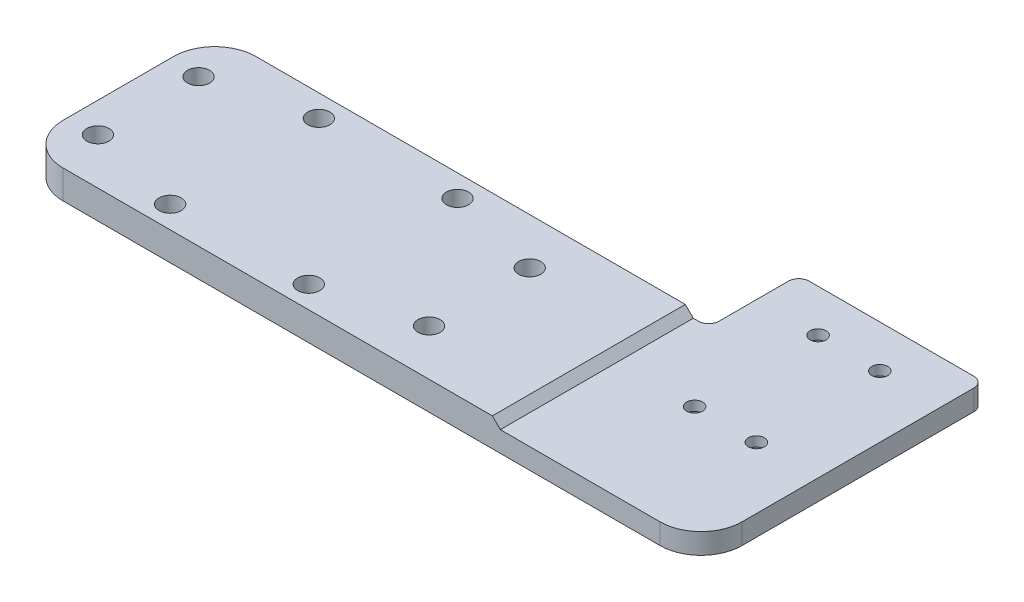
ISO-10303-21;
HEADER;
FILE_DESCRIPTION(('STEP AP214'),'2;1');
FILE_NAME('part.step','',(''),(''),'','','');
FILE_SCHEMA(('AUTOMOTIVE_DESIGN { 1 0 10303 214 1 1 1 1 }'));
ENDSEC;
DATA;
#1=APPLICATION_CONTEXT('core data for automotive mechanical design processes');
#2=APPLICATION_PROTOCOL_DEFINITION('international standard','automotive_design',2000,#1);
#3=PRODUCT_CONTEXT('',#1,'mechanical');
#4=PRODUCT('Part','Part','',(#3));
#5=PRODUCT_RELATED_PRODUCT_CATEGORY('part','',(#4));
#6=PRODUCT_DEFINITION_FORMATION('','',#4);
#7=PRODUCT_DEFINITION_CONTEXT('part definition',#1,'design');
#8=PRODUCT_DEFINITION('design','',#6,#7);
#9=PRODUCT_DEFINITION_SHAPE('','',#8);
#10=(LENGTH_UNIT() NAMED_UNIT(*) SI_UNIT(.MILLI.,.METRE.));
#11=(NAMED_UNIT(*) PLANE_ANGLE_UNIT() SI_UNIT($,.RADIAN.));
#12=(NAMED_UNIT(*) SI_UNIT($,.STERADIAN.) SOLID_ANGLE_UNIT());
#13=UNCERTAINTY_MEASURE_WITH_UNIT(LENGTH_MEASURE(1.E-05),#10,'distance_accuracy_value','');
#14=(GEOMETRIC_REPRESENTATION_CONTEXT(3) GLOBAL_UNCERTAINTY_ASSIGNED_CONTEXT((#13)) GLOBAL_UNIT_ASSIGNED_CONTEXT((#10,
#11,#12)) REPRESENTATION_CONTEXT('',''));
#15=CARTESIAN_POINT('',(0.,0.,0.));
#16=DIRECTION('',(0.,0.,1.));
#17=DIRECTION('',(1.,0.,0.));
#18=AXIS2_PLACEMENT_3D('',#15,#16,#17);
#19=CARTESIAN_POINT('',(0.,0.,0.));
#20=DIRECTION('',(0.,1.,0.));
#21=DIRECTION('',(0.,0.,1.));
#22=AXIS2_PLACEMENT_3D('',#19,#20,#21);
#23=PLANE('',#22);
#24=CARTESIAN_POINT('',(32.1751870394475,0.,-9.779));
#25=DIRECTION('',(0.,-1.,0.));
#26=DIRECTION('',(0.,0.,-1.));
#27=AXIS2_PLACEMENT_3D('',#24,#25,#26);
#28=CIRCLE('',#27,2.15264999999999);
#29=CARTESIAN_POINT('',(32.1751870394475,0.,-11.93165));
#30=VERTEX_POINT('',#29);
#31=EDGE_CURVE('E494',#30,#30,#28,.T.);
#32=ORIENTED_EDGE('',*,*,#31,.F.);
#33=EDGE_LOOP('',(#32));
#34=FACE_BOUND('',#33,.T.);
#35=CARTESIAN_POINT('',(32.1751870394475,0.,9.779));
#36=DIRECTION('',(0.,-1.,0.));
#37=DIRECTION('',(0.,0.,-1.));
#38=AXIS2_PLACEMENT_3D('',#35,#36,#37);
#39=CIRCLE('',#38,2.15264999999999);
#40=CARTESIAN_POINT('',(32.1751870394475,0.,7.62635000000001));
#41=VERTEX_POINT('',#40);
#42=EDGE_CURVE('E489',#41,#41,#39,.T.);
#43=ORIENTED_EDGE('',*,*,#42,.F.);
#44=EDGE_LOOP('',(#43));
#45=FACE_BOUND('',#44,.T.);
#46=CARTESIAN_POINT('',(-32.1751870394475,0.,-9.779));
#47=DIRECTION('',(0.,-1.,0.));
#48=DIRECTION('',(0.,0.,-1.));
#49=AXIS2_PLACEMENT_3D('',#46,#47,#48);
#50=CIRCLE('',#49,2.15264999999999);
#51=CARTESIAN_POINT('',(-32.1751870394475,0.,-11.93165));
#52=VERTEX_POINT('',#51);
#53=EDGE_CURVE('E483',#52,#52,#50,.T.);
#54=ORIENTED_EDGE('',*,*,#53,.F.);
#55=EDGE_LOOP('',(#54));
#56=FACE_BOUND('',#55,.T.);
#57=CARTESIAN_POINT('',(-32.1751870394475,0.,9.779));
#58=DIRECTION('',(0.,-1.,0.));
#59=DIRECTION('',(0.,0.,-1.));
#60=AXIS2_PLACEMENT_3D('',#57,#58,#59);
#61=CIRCLE('',#60,2.15264999999999);
#62=CARTESIAN_POINT('',(-32.1751870394475,0.,7.62635000000001));
#63=VERTEX_POINT('',#62);
#64=EDGE_CURVE('E477',#63,#63,#61,.T.);
#65=ORIENTED_EDGE('',*,*,#64,.F.);
#66=EDGE_LOOP('',(#65));
#67=FACE_BOUND('',#66,.T.);
#68=CARTESIAN_POINT('',(-13.4703841816038,0.,14.45));
#69=DIRECTION('',(0.,-1.,0.));
#70=DIRECTION('',(0.,0.,-1.));
#71=AXIS2_PLACEMENT_3D('',#68,#69,#70);
#72=CIRCLE('',#71,2.15264999999999);
#73=CARTESIAN_POINT('',(-13.4703841816038,0.,12.29735));
#74=VERTEX_POINT('',#73);
#75=EDGE_CURVE('E471',#74,#74,#72,.T.);
#76=ORIENTED_EDGE('',*,*,#75,.F.);
#77=EDGE_LOOP('',(#76));
#78=FACE_BOUND('',#77,.T.);
#79=CARTESIAN_POINT('',(-13.4703841816038,0.,-14.45));
#80=DIRECTION('',(0.,-1.,0.));
#81=DIRECTION('',(0.,0.,-1.));
#82=AXIS2_PLACEMENT_3D('',#79,#80,#81);
#83=CIRCLE('',#82,2.15264999999999);
#84=CARTESIAN_POINT('',(-13.4703841816038,0.,-16.60265));
#85=VERTEX_POINT('',#84);
#86=EDGE_CURVE('E459',#85,#85,#83,.T.);
#87=ORIENTED_EDGE('',*,*,#86,.F.);
#88=EDGE_LOOP('',(#87));
#89=FACE_BOUND('',#88,.T.);
#90=CARTESIAN_POINT('',(13.4703841816038,0.,-14.45));
#91=DIRECTION('',(0.,-1.,0.));
#92=DIRECTION('',(0.,0.,-1.));
#93=AXIS2_PLACEMENT_3D('',#90,#91,#92);
#94=CIRCLE('',#93,2.15264999999999);
#95=CARTESIAN_POINT('',(13.4703841816038,0.,-16.60265));
#96=VERTEX_POINT('',#95);
#97=EDGE_CURVE('E453',#96,#96,#94,.T.);
#98=ORIENTED_EDGE('',*,*,#97,.F.);
#99=EDGE_LOOP('',(#98));
#100=FACE_BOUND('',#99,.T.);
#101=CARTESIAN_POINT('',(82.,0.,-28.));
#102=DIRECTION('',(0.,-1.,0.));
#103=DIRECTION('',(0.,0.,-1.));
#104=AXIS2_PLACEMENT_3D('',#101,#102,#103);
#105=CIRCLE('',#104,2.99999999999999);
#106=CARTESIAN_POINT('',(82.,0.,-31.));
#107=VERTEX_POINT('',#106);
#108=EDGE_CURVE('E447',#107,#107,#105,.T.);
#109=ORIENTED_EDGE('',*,*,#108,.F.);
#110=EDGE_LOOP('',(#109));
#111=FACE_BOUND('',#110,.T.);
#112=CARTESIAN_POINT('',(82.,0.,-4.));
#113=DIRECTION('',(0.,-1.,0.));
#114=DIRECTION('',(0.,0.,-1.));
#115=AXIS2_PLACEMENT_3D('',#112,#113,#114);
#116=CIRCLE('',#115,2.99999999999999);
#117=CARTESIAN_POINT('',(82.,0.,-6.99999999999999));
#118=VERTEX_POINT('',#117);
#119=EDGE_CURVE('E232',#118,#118,#116,.T.);
#120=ORIENTED_EDGE('',*,*,#119,.F.);
#121=EDGE_LOOP('',(#120));
#122=FACE_BOUND('',#121,.T.);
#123=CARTESIAN_POINT('',(70.,0.,-4.));
#124=DIRECTION('',(0.,-1.,0.));
#125=DIRECTION('',(0.,0.,-1.));
#126=AXIS2_PLACEMENT_3D('',#123,#124,#125);
#127=CIRCLE('',#126,3.);
#128=CARTESIAN_POINT('',(70.,0.,-7.));
#129=VERTEX_POINT('',#128);
#130=EDGE_CURVE('E227',#129,#129,#127,.T.);
#131=ORIENTED_EDGE('',*,*,#130,.F.);
#132=EDGE_LOOP('',(#131));
#133=FACE_BOUND('',#132,.T.);
#134=CARTESIAN_POINT('',(70.,0.,-28.));
#135=DIRECTION('',(0.,-1.,0.));
#136=DIRECTION('',(0.,0.,-1.));
#137=AXIS2_PLACEMENT_3D('',#134,#135,#136);
#138=CIRCLE('',#137,3.);
#139=CARTESIAN_POINT('',(70.,0.,-31.));
#140=VERTEX_POINT('',#139);
#141=EDGE_CURVE('E222',#140,#140,#138,.T.);
#142=ORIENTED_EDGE('',*,*,#141,.F.);
#143=EDGE_LOOP('',(#142));
#144=FACE_BOUND('',#143,.T.);
#145=DIRECTION('',(0.,0.,1.));
#146=VECTOR('',#145,1.);
#147=CARTESIAN_POINT('',(58.,0.,-18.75));
#148=LINE('',#147,#146);
#149=CARTESIAN_POINT('',(58.,0.,-34.25));
#150=VERTEX_POINT('',#149);
#151=CARTESIAN_POINT('',(58.,0.,-20.75));
#152=VERTEX_POINT('',#151);
#153=EDGE_CURVE('E176',#150,#152,#148,.T.);
#154=ORIENTED_EDGE('',*,*,#153,.F.);
#155=CARTESIAN_POINT('',(60.,0.,-34.25));
#156=DIRECTION('',(0.,1.,0.));
#157=DIRECTION('',(0.,0.,1.));
#158=AXIS2_PLACEMENT_3D('',#155,#156,#157);
#159=CIRCLE('',#158,2.);
#160=CARTESIAN_POINT('',(60.,0.,-36.25));
#161=VERTEX_POINT('',#160);
#162=EDGE_CURVE('E243',#150,#161,#159,.F.);
#163=ORIENTED_EDGE('',*,*,#162,.T.);
#164=DIRECTION('',(-1.,0.,0.));
#165=VECTOR('',#164,1.);
#166=CARTESIAN_POINT('',(58.,0.,-36.25));
#167=LINE('',#166,#165);
#168=CARTESIAN_POINT('',(92.,0.,-36.25));
#169=VERTEX_POINT('',#168);
#170=EDGE_CURVE('E164',#169,#161,#167,.T.);
#171=ORIENTED_EDGE('',*,*,#170,.F.);
#172=CARTESIAN_POINT('',(92.,0.,-34.25));
#173=DIRECTION('',(0.,1.,0.));
#174=DIRECTION('',(0.,0.,1.));
#175=AXIS2_PLACEMENT_3D('',#172,#173,#174);
#176=CIRCLE('',#175,2.);
#177=CARTESIAN_POINT('',(94.,0.,-34.25));
#178=VERTEX_POINT('',#177);
#179=EDGE_CURVE('E241',#169,#178,#176,.F.);
#180=ORIENTED_EDGE('',*,*,#179,.T.);
#181=DIRECTION('',(0.,0.,-1.));
#182=VECTOR('',#181,1.);
#183=CARTESIAN_POINT('',(94.,0.,18.75));
#184=LINE('',#183,#182);
#185=CARTESIAN_POINT('',(94.,0.,10.75));
#186=VERTEX_POINT('',#185);
#187=EDGE_CURVE('E168',#186,#178,#184,.T.);
#188=ORIENTED_EDGE('',*,*,#187,.F.);
#189=CARTESIAN_POINT('',(86.,0.,10.75));
#190=DIRECTION('',(0.,1.,0.));
#191=DIRECTION('',(0.,0.,1.));
#192=AXIS2_PLACEMENT_3D('',#189,#190,#191);
#193=CIRCLE('',#192,8.);
#194=CARTESIAN_POINT('',(86.,0.,18.75));
#195=VERTEX_POINT('',#194);
#196=EDGE_CURVE('E195',#186,#195,#193,.F.);
#197=ORIENTED_EDGE('',*,*,#196,.T.);
#198=DIRECTION('',(1.,0.,0.));
#199=VECTOR('',#198,1.);
#200=CARTESIAN_POINT('',(-38.,0.,18.75));
#201=LINE('',#200,#199);
#202=CARTESIAN_POINT('',(-30.,0.,18.75));
#203=VERTEX_POINT('',#202);
#204=EDGE_CURVE('E184',#203,#195,#201,.T.);
#205=ORIENTED_EDGE('',*,*,#204,.F.);
#206=CARTESIAN_POINT('',(-30.,0.,10.75));
#207=DIRECTION('',(0.,1.,0.));
#208=DIRECTION('',(0.,0.,1.));
#209=AXIS2_PLACEMENT_3D('',#206,#207,#208);
#210=CIRCLE('',#209,8.);
#211=CARTESIAN_POINT('',(-38.,0.,10.75));
#212=VERTEX_POINT('',#211);
#213=EDGE_CURVE('E193',#203,#212,#210,.F.);
#214=ORIENTED_EDGE('',*,*,#213,.T.);
#215=DIRECTION('',(0.,0.,1.));
#216=VECTOR('',#215,1.);
#217=CARTESIAN_POINT('',(-38.,0.,18.75));
#218=LINE('',#217,#216);
#219=CARTESIAN_POINT('',(-38.,0.,-10.75));
#220=VERTEX_POINT('',#219);
#221=EDGE_CURVE('E181',#220,#212,#218,.T.);
#222=ORIENTED_EDGE('',*,*,#221,.F.);
#223=CARTESIAN_POINT('',(-30.,0.,-10.75));
#224=DIRECTION('',(0.,1.,0.));
#225=DIRECTION('',(0.,0.,1.));
#226=AXIS2_PLACEMENT_3D('',#223,#224,#225);
#227=CIRCLE('',#226,8.);
#228=CARTESIAN_POINT('',(-30.,0.,-18.75));
#229=VERTEX_POINT('',#228);
#230=EDGE_CURVE('E190',#220,#229,#227,.F.);
#231=ORIENTED_EDGE('',*,*,#230,.T.);
#232=DIRECTION('',(-1.,0.,0.));
#233=VECTOR('',#232,1.);
#234=CARTESIAN_POINT('',(-38.,0.,-18.75));
#235=LINE('',#234,#233);
#236=CARTESIAN_POINT('',(56.,0.,-18.75));
#237=VERTEX_POINT('',#236);
#238=EDGE_CURVE('E179',#237,#229,#235,.T.);
#239=ORIENTED_EDGE('',*,*,#238,.F.);
#240=CARTESIAN_POINT('',(56.,0.,-20.75));
#241=DIRECTION('',(0.,1.,0.));
#242=DIRECTION('',(0.,0.,1.));
#243=AXIS2_PLACEMENT_3D('',#240,#241,#242);
#244=CIRCLE('',#243,2.);
#245=EDGE_CURVE('E256',#237,#152,#244,.T.);
#246=ORIENTED_EDGE('',*,*,#245,.T.);
#247=EDGE_LOOP('',(#154,#163,#171,#180,#188,#197,#205,#214,#222,#231,#239,#246));
#248=FACE_BOUND('',#247,.T.);
#249=CARTESIAN_POINT('',(13.4703841816038,0.,14.45));
#250=DIRECTION('',(0.,-1.,0.));
#251=DIRECTION('',(0.,0.,-1.));
#252=AXIS2_PLACEMENT_3D('',#249,#250,#251);
#253=CIRCLE('',#252,2.15264999999999);
#254=CARTESIAN_POINT('',(13.4703841816038,0.,12.29735));
#255=VERTEX_POINT('',#254);
#256=EDGE_CURVE('E465',#255,#255,#253,.T.);
#257=ORIENTED_EDGE('',*,*,#256,.F.);
#258=EDGE_LOOP('',(#257));
#259=FACE_BOUND('',#258,.T.);
#260=ADVANCED_FACE('F33',(#34,#45,#56,#67,#78,#89,#100,#111,#122,#133,#144,#248,#259),#23,.F.);
#261=CARTESIAN_POINT('',(58.,5.55,-36.25));
#262=DIRECTION('',(0.,0.,1.));
#263=DIRECTION('',(1.,0.,0.));
#264=AXIS2_PLACEMENT_3D('',#261,#262,#263);
#265=PLANE('',#264);
#266=ORIENTED_EDGE('',*,*,#170,.T.);
#267=DIRECTION('',(0.,-1.,0.));
#268=VECTOR('',#267,1.);
#269=CARTESIAN_POINT('',(60.,5.55,-36.25));
#270=LINE('',#269,#268);
#271=CARTESIAN_POINT('',(60.,4.,-36.25));
#272=VERTEX_POINT('',#271);
#273=EDGE_CURVE('E248',#161,#272,#270,.F.);
#274=ORIENTED_EDGE('',*,*,#273,.T.);
#275=DIRECTION('',(-1.,0.,0.));
#276=VECTOR('',#275,1.);
#277=CARTESIAN_POINT('',(55.,4.,-36.25));
#278=LINE('',#277,#276);
#279=CARTESIAN_POINT('',(92.,4.,-36.25));
#280=VERTEX_POINT('',#279);
#281=EDGE_CURVE('E155',#280,#272,#278,.T.);
#282=ORIENTED_EDGE('',*,*,#281,.F.);
#283=DIRECTION('',(0.,-1.,0.));
#284=VECTOR('',#283,1.);
#285=CARTESIAN_POINT('',(92.,5.55,-36.25));
#286=LINE('',#285,#284);
#287=EDGE_CURVE('E245',#280,#169,#286,.T.);
#288=ORIENTED_EDGE('',*,*,#287,.T.);
#289=EDGE_LOOP('',(#266,#274,#282,#288));
#290=FACE_BOUND('',#289,.T.);
#291=ADVANCED_FACE('F279',(#290),#265,.F.);
#292=CARTESIAN_POINT('',(58.,5.55,-18.75));
#293=DIRECTION('',(1.,0.,0.));
#294=DIRECTION('',(0.,0.,-1.));
#295=AXIS2_PLACEMENT_3D('',#292,#293,#294);
#296=PLANE('',#295);
#297=ORIENTED_EDGE('',*,*,#153,.T.);
#298=DIRECTION('',(0.,-1.,0.));
#299=VECTOR('',#298,1.);
#300=CARTESIAN_POINT('',(58.,4.,-20.75));
#301=LINE('',#300,#299);
#302=CARTESIAN_POINT('',(58.,4.,-20.75));
#303=VERTEX_POINT('',#302);
#304=EDGE_CURVE('E239',#152,#303,#301,.F.);
#305=ORIENTED_EDGE('',*,*,#304,.T.);
#306=DIRECTION('',(0.,0.,1.));
#307=VECTOR('',#306,1.);
#308=CARTESIAN_POINT('',(58.,4.,-18.75));
#309=LINE('',#308,#307);
#310=CARTESIAN_POINT('',(58.,4.,-34.25));
#311=VERTEX_POINT('',#310);
#312=EDGE_CURVE('E161',#311,#303,#309,.T.);
#313=ORIENTED_EDGE('',*,*,#312,.F.);
#314=DIRECTION('',(0.,-1.,0.));
#315=VECTOR('',#314,1.);
#316=CARTESIAN_POINT('',(58.,5.55,-34.25));
#317=LINE('',#316,#315);
#318=EDGE_CURVE('E236',#311,#150,#317,.T.);
#319=ORIENTED_EDGE('',*,*,#318,.T.);
#320=EDGE_LOOP('',(#297,#305,#313,#319));
#321=FACE_BOUND('',#320,.T.);
#322=ADVANCED_FACE('F271',(#321),#296,.F.);
#323=CARTESIAN_POINT('',(94.,5.55,18.75));
#324=DIRECTION('',(-1.,0.,0.));
#325=DIRECTION('',(0.,0.,1.));
#326=AXIS2_PLACEMENT_3D('',#323,#324,#325);
#327=PLANE('',#326);
#328=ORIENTED_EDGE('',*,*,#187,.T.);
#329=DIRECTION('',(0.,-1.,0.));
#330=VECTOR('',#329,1.);
#331=CARTESIAN_POINT('',(94.,5.55,-34.25));
#332=LINE('',#331,#330);
#333=CARTESIAN_POINT('',(94.,4.,-34.25));
#334=VERTEX_POINT('',#333);
#335=EDGE_CURVE('E254',#178,#334,#332,.F.);
#336=ORIENTED_EDGE('',*,*,#335,.T.);
#337=DIRECTION('',(0.,0.,-1.));
#338=VECTOR('',#337,1.);
#339=CARTESIAN_POINT('',(94.,4.,-36.25));
#340=LINE('',#339,#338);
#341=CARTESIAN_POINT('',(94.,4.,10.75));
#342=VERTEX_POINT('',#341);
#343=EDGE_CURVE('E152',#342,#334,#340,.T.);
#344=ORIENTED_EDGE('',*,*,#343,.F.);
#345=DIRECTION('',(0.,-1.,0.));
#346=VECTOR('',#345,1.);
#347=CARTESIAN_POINT('',(94.,5.55,10.75));
#348=LINE('',#347,#346);
#349=EDGE_CURVE('E173',#342,#186,#348,.T.);
#350=ORIENTED_EDGE('',*,*,#349,.T.);
#351=EDGE_LOOP('',(#328,#336,#344,#350));
#352=FACE_BOUND('',#351,.T.);
#353=ADVANCED_FACE('F288',(#352),#327,.F.);
#354=CARTESIAN_POINT('',(-38.,5.55,-18.75));
#355=DIRECTION('',(0.,0.,1.));
#356=DIRECTION('',(1.,0.,0.));
#357=AXIS2_PLACEMENT_3D('',#354,#355,#356);
#358=PLANE('',#357);
#359=DIRECTION('',(-1.,0.,0.));
#360=VECTOR('',#359,1.);
#361=CARTESIAN_POINT('',(-38.,5.55,-18.75));
#362=LINE('',#361,#360);
#363=CARTESIAN_POINT('',(53.45,5.55,-18.75));
#364=VERTEX_POINT('',#363);
#365=CARTESIAN_POINT('',(-30.,5.55,-18.75));
#366=VERTEX_POINT('',#365);
#367=EDGE_CURVE('E165',#364,#366,#362,.T.);
#368=ORIENTED_EDGE('',*,*,#367,.F.);
#369=DIRECTION('',(0.707106781186548,-0.707106781186548,0.));
#370=VECTOR('',#369,1.);
#371=CARTESIAN_POINT('',(55.,3.99999999999999,-18.75));
#372=LINE('',#371,#370);
#373=CARTESIAN_POINT('',(55.,4.,-18.75));
#374=VERTEX_POINT('',#373);
#375=EDGE_CURVE('E11',#364,#374,#372,.T.);
#376=ORIENTED_EDGE('',*,*,#375,.T.);
#377=DIRECTION('',(-1.,0.,0.));
#378=VECTOR('',#377,1.);
#379=CARTESIAN_POINT('',(-38.,4.,-18.75));
#380=LINE('',#379,#378);
#381=CARTESIAN_POINT('',(56.,4.,-18.75));
#382=VERTEX_POINT('',#381);
#383=EDGE_CURVE('E145',#382,#374,#380,.T.);
#384=ORIENTED_EDGE('',*,*,#383,.F.);
#385=DIRECTION('',(0.,-1.,0.));
#386=VECTOR('',#385,1.);
#387=CARTESIAN_POINT('',(56.,0.,-18.75));
#388=LINE('',#387,#386);
#389=EDGE_CURVE('E215',#382,#237,#388,.T.);
#390=ORIENTED_EDGE('',*,*,#389,.T.);
#391=ORIENTED_EDGE('',*,*,#238,.T.);
#392=DIRECTION('',(0.,-1.,0.));
#393=VECTOR('',#392,1.);
#394=CARTESIAN_POINT('',(-30.,5.55,-18.75));
#395=LINE('',#394,#393);
#396=EDGE_CURVE('E212',#229,#366,#395,.F.);
#397=ORIENTED_EDGE('',*,*,#396,.T.);
#398=EDGE_LOOP('',(#368,#376,#384,#390,#391,#397));
#399=FACE_BOUND('',#398,.T.);
#400=ADVANCED_FACE('F264',(#399),#358,.F.);
#401=CARTESIAN_POINT('',(-38.,5.55,18.75));
#402=DIRECTION('',(1.,0.,0.));
#403=DIRECTION('',(0.,0.,-1.));
#404=AXIS2_PLACEMENT_3D('',#401,#402,#403);
#405=PLANE('',#404);
#406=ORIENTED_EDGE('',*,*,#221,.T.);
#407=DIRECTION('',(0.,-1.,0.));
#408=VECTOR('',#407,1.);
#409=CARTESIAN_POINT('',(-38.,5.55,10.75));
#410=LINE('',#409,#408);
#411=CARTESIAN_POINT('',(-38.,5.55,10.75));
#412=VERTEX_POINT('',#411);
#413=EDGE_CURVE('E206',#212,#412,#410,.F.);
#414=ORIENTED_EDGE('',*,*,#413,.T.);
#415=DIRECTION('',(0.,0.,1.));
#416=VECTOR('',#415,1.);
#417=CARTESIAN_POINT('',(-38.,5.55,18.75));
#418=LINE('',#417,#416);
#419=CARTESIAN_POINT('',(-38.,5.55,-10.75));
#420=VERTEX_POINT('',#419);
#421=EDGE_CURVE('E167',#420,#412,#418,.T.);
#422=ORIENTED_EDGE('',*,*,#421,.F.);
#423=DIRECTION('',(0.,-1.,0.));
#424=VECTOR('',#423,1.);
#425=CARTESIAN_POINT('',(-38.,5.55,-10.75));
#426=LINE('',#425,#424);
#427=EDGE_CURVE('E203',#420,#220,#426,.T.);
#428=ORIENTED_EDGE('',*,*,#427,.T.);
#429=EDGE_LOOP('',(#406,#414,#422,#428));
#430=FACE_BOUND('',#429,.T.);
#431=ADVANCED_FACE('F301',(#430),#405,.F.);
#432=CARTESIAN_POINT('',(-38.,5.55,18.75));
#433=DIRECTION('',(0.,0.,-1.));
#434=DIRECTION('',(-1.,0.,0.));
#435=AXIS2_PLACEMENT_3D('',#432,#433,#434);
#436=PLANE('',#435);
#437=DIRECTION('',(1.,0.,0.));
#438=VECTOR('',#437,1.);
#439=CARTESIAN_POINT('',(55.,4.,18.75));
#440=LINE('',#439,#438);
#441=CARTESIAN_POINT('',(55.,4.,18.75));
#442=VERTEX_POINT('',#441);
#443=CARTESIAN_POINT('',(86.,4.,18.75));
#444=VERTEX_POINT('',#443);
#445=EDGE_CURVE('E142',#442,#444,#440,.T.);
#446=ORIENTED_EDGE('',*,*,#445,.F.);
#447=DIRECTION('',(-0.707106781186548,0.707106781186548,0.));
#448=VECTOR('',#447,1.);
#449=CARTESIAN_POINT('',(55.,3.99999999999999,18.75));
#450=LINE('',#449,#448);
#451=CARTESIAN_POINT('',(53.45,5.55,18.75));
#452=VERTEX_POINT('',#451);
#453=EDGE_CURVE('E55',#442,#452,#450,.T.);
#454=ORIENTED_EDGE('',*,*,#453,.T.);
#455=DIRECTION('',(1.,0.,0.));
#456=VECTOR('',#455,1.);
#457=CARTESIAN_POINT('',(-38.,5.55,18.75));
#458=LINE('',#457,#456);
#459=CARTESIAN_POINT('',(-30.,5.55,18.75));
#460=VERTEX_POINT('',#459);
#461=EDGE_CURVE('E171',#460,#452,#458,.T.);
#462=ORIENTED_EDGE('',*,*,#461,.F.);
#463=DIRECTION('',(0.,-1.,0.));
#464=VECTOR('',#463,1.);
#465=CARTESIAN_POINT('',(-30.,5.55,18.75));
#466=LINE('',#465,#464);
#467=EDGE_CURVE('E197',#460,#203,#466,.T.);
#468=ORIENTED_EDGE('',*,*,#467,.T.);
#469=ORIENTED_EDGE('',*,*,#204,.T.);
#470=DIRECTION('',(0.,-1.,0.));
#471=VECTOR('',#470,1.);
#472=CARTESIAN_POINT('',(86.,5.55,18.75));
#473=LINE('',#472,#471);
#474=EDGE_CURVE('E151',#195,#444,#473,.F.);
#475=ORIENTED_EDGE('',*,*,#474,.T.);
#476=EDGE_LOOP('',(#446,#454,#462,#468,#469,#475));
#477=FACE_BOUND('',#476,.T.);
#478=ADVANCED_FACE('F148',(#477),#436,.F.);
#479=CARTESIAN_POINT('',(0.,5.55,0.));
#480=DIRECTION('',(0.,1.,0.));
#481=DIRECTION('',(0.,0.,1.));
#482=AXIS2_PLACEMENT_3D('',#479,#480,#481);
#483=PLANE('',#482);
#484=CARTESIAN_POINT('',(32.1751870394475,5.55,-9.779));
#485=DIRECTION('',(0.,-1.,0.));
#486=DIRECTION('',(0.,0.,-1.));
#487=AXIS2_PLACEMENT_3D('',#484,#485,#486);
#488=CIRCLE('',#487,2.15265);
#489=CARTESIAN_POINT('',(32.1751870394475,5.55,-11.93165));
#490=VERTEX_POINT('',#489);
#491=EDGE_CURVE('E492',#490,#490,#488,.T.);
#492=ORIENTED_EDGE('',*,*,#491,.T.);
#493=EDGE_LOOP('',(#492));
#494=FACE_BOUND('',#493,.T.);
#495=CARTESIAN_POINT('',(32.1751870394475,5.55,9.779));
#496=DIRECTION('',(0.,-1.,0.));
#497=DIRECTION('',(0.,0.,-1.));
#498=AXIS2_PLACEMENT_3D('',#495,#496,#497);
#499=CIRCLE('',#498,2.15265);
#500=CARTESIAN_POINT('',(32.1751870394475,5.55,7.62635));
#501=VERTEX_POINT('',#500);
#502=EDGE_CURVE('E486',#501,#501,#499,.T.);
#503=ORIENTED_EDGE('',*,*,#502,.T.);
#504=EDGE_LOOP('',(#503));
#505=FACE_BOUND('',#504,.T.);
#506=CARTESIAN_POINT('',(-32.1751870394475,5.55,-9.779));
#507=DIRECTION('',(0.,-1.,0.));
#508=DIRECTION('',(0.,0.,-1.));
#509=AXIS2_PLACEMENT_3D('',#506,#507,#508);
#510=CIRCLE('',#509,2.15265);
#511=CARTESIAN_POINT('',(-32.1751870394475,5.55,-11.93165));
#512=VERTEX_POINT('',#511);
#513=EDGE_CURVE('E480',#512,#512,#510,.T.);
#514=ORIENTED_EDGE('',*,*,#513,.T.);
#515=EDGE_LOOP('',(#514));
#516=FACE_BOUND('',#515,.T.);
#517=CARTESIAN_POINT('',(-32.1751870394475,5.55,9.779));
#518=DIRECTION('',(0.,-1.,0.));
#519=DIRECTION('',(0.,0.,-1.));
#520=AXIS2_PLACEMENT_3D('',#517,#518,#519);
#521=CIRCLE('',#520,2.15265);
#522=CARTESIAN_POINT('',(-32.1751870394475,5.55,7.62635));
#523=VERTEX_POINT('',#522);
#524=EDGE_CURVE('E474',#523,#523,#521,.T.);
#525=ORIENTED_EDGE('',*,*,#524,.T.);
#526=EDGE_LOOP('',(#525));
#527=FACE_BOUND('',#526,.T.);
#528=CARTESIAN_POINT('',(-13.4703841816038,5.55,14.45));
#529=DIRECTION('',(0.,-1.,0.));
#530=DIRECTION('',(0.,0.,-1.));
#531=AXIS2_PLACEMENT_3D('',#528,#529,#530);
#532=CIRCLE('',#531,2.15265);
#533=CARTESIAN_POINT('',(-13.4703841816038,5.55,12.29735));
#534=VERTEX_POINT('',#533);
#535=EDGE_CURVE('E468',#534,#534,#532,.T.);
#536=ORIENTED_EDGE('',*,*,#535,.T.);
#537=EDGE_LOOP('',(#536));
#538=FACE_BOUND('',#537,.T.);
#539=CARTESIAN_POINT('',(13.4703841816038,5.55,14.45));
#540=DIRECTION('',(0.,-1.,0.));
#541=DIRECTION('',(0.,0.,-1.));
#542=AXIS2_PLACEMENT_3D('',#539,#540,#541);
#543=CIRCLE('',#542,2.15265);
#544=CARTESIAN_POINT('',(13.4703841816038,5.55,12.29735));
#545=VERTEX_POINT('',#544);
#546=EDGE_CURVE('E462',#545,#545,#543,.T.);
#547=ORIENTED_EDGE('',*,*,#546,.T.);
#548=EDGE_LOOP('',(#547));
#549=FACE_BOUND('',#548,.T.);
#550=CARTESIAN_POINT('',(-13.4703841816038,5.55,-14.45));
#551=DIRECTION('',(0.,-1.,0.));
#552=DIRECTION('',(0.,0.,-1.));
#553=AXIS2_PLACEMENT_3D('',#550,#551,#552);
#554=CIRCLE('',#553,2.15265);
#555=CARTESIAN_POINT('',(-13.4703841816038,5.55,-16.60265));
#556=VERTEX_POINT('',#555);
#557=EDGE_CURVE('E456',#556,#556,#554,.T.);
#558=ORIENTED_EDGE('',*,*,#557,.T.);
#559=EDGE_LOOP('',(#558));
#560=FACE_BOUND('',#559,.T.);
#561=CARTESIAN_POINT('',(13.4703841816038,5.55,-14.45));
#562=DIRECTION('',(0.,-1.,0.));
#563=DIRECTION('',(0.,0.,-1.));
#564=AXIS2_PLACEMENT_3D('',#561,#562,#563);
#565=CIRCLE('',#564,2.15265);
#566=CARTESIAN_POINT('',(13.4703841816038,5.55,-16.60265));
#567=VERTEX_POINT('',#566);
#568=EDGE_CURVE('E450',#567,#567,#565,.T.);
#569=ORIENTED_EDGE('',*,*,#568,.T.);
#570=EDGE_LOOP('',(#569));
#571=FACE_BOUND('',#570,.T.);
#572=ORIENTED_EDGE('',*,*,#461,.T.);
#573=DIRECTION('',(0.,0.,-1.));
#574=VECTOR('',#573,1.);
#575=CARTESIAN_POINT('',(53.45,5.55,-18.75));
#576=LINE('',#575,#574);
#577=EDGE_CURVE('E41',#452,#364,#576,.T.);
#578=ORIENTED_EDGE('',*,*,#577,.T.);
#579=ORIENTED_EDGE('',*,*,#367,.T.);
#580=CARTESIAN_POINT('',(-30.,5.55,-10.75));
#581=DIRECTION('',(0.,1.,0.));
#582=DIRECTION('',(0.,0.,1.));
#583=AXIS2_PLACEMENT_3D('',#580,#581,#582);
#584=CIRCLE('',#583,8.);
#585=EDGE_CURVE('E208',#366,#420,#584,.T.);
#586=ORIENTED_EDGE('',*,*,#585,.T.);
#587=ORIENTED_EDGE('',*,*,#421,.T.);
#588=CARTESIAN_POINT('',(-30.,5.55,10.75));
#589=DIRECTION('',(0.,1.,0.));
#590=DIRECTION('',(0.,0.,1.));
#591=AXIS2_PLACEMENT_3D('',#588,#589,#590);
#592=CIRCLE('',#591,8.);
#593=EDGE_CURVE('E210',#412,#460,#592,.T.);
#594=ORIENTED_EDGE('',*,*,#593,.T.);
#595=EDGE_LOOP('',(#572,#578,#579,#586,#587,#594));
#596=FACE_BOUND('',#595,.T.);
#597=ADVANCED_FACE('F308',(#494,#505,#516,#527,#538,#549,#560,#571,#596),#483,.T.);
#598=CARTESIAN_POINT('',(0.,4.,0.));
#599=DIRECTION('',(0.,1.,0.));
#600=DIRECTION('',(0.,0.,1.));
#601=AXIS2_PLACEMENT_3D('',#598,#599,#600);
#602=PLANE('',#601);
#603=CARTESIAN_POINT('',(82.,4.,-28.));
#604=DIRECTION('',(0.,1.,0.));
#605=DIRECTION('',(0.,0.,1.));
#606=AXIS2_PLACEMENT_3D('',#603,#604,#605);
#607=CIRCLE('',#606,1.55);
#608=CARTESIAN_POINT('',(82.,4.,-26.45));
#609=VERTEX_POINT('',#608);
#610=EDGE_CURVE('E229',#609,#609,#607,.T.);
#611=ORIENTED_EDGE('',*,*,#610,.F.);
#612=EDGE_LOOP('',(#611));
#613=FACE_BOUND('',#612,.T.);
#614=CARTESIAN_POINT('',(82.,4.,-4.));
#615=DIRECTION('',(0.,1.,0.));
#616=DIRECTION('',(0.,0.,1.));
#617=AXIS2_PLACEMENT_3D('',#614,#615,#616);
#618=CIRCLE('',#617,1.55);
#619=CARTESIAN_POINT('',(82.,4.,-2.45));
#620=VERTEX_POINT('',#619);
#621=EDGE_CURVE('E224',#620,#620,#618,.T.);
#622=ORIENTED_EDGE('',*,*,#621,.F.);
#623=EDGE_LOOP('',(#622));
#624=FACE_BOUND('',#623,.T.);
#625=CARTESIAN_POINT('',(70.,4.,-4.));
#626=DIRECTION('',(0.,1.,0.));
#627=DIRECTION('',(0.,0.,1.));
#628=AXIS2_PLACEMENT_3D('',#625,#626,#627);
#629=CIRCLE('',#628,1.55);
#630=CARTESIAN_POINT('',(70.,4.,-2.45));
#631=VERTEX_POINT('',#630);
#632=EDGE_CURVE('E219',#631,#631,#629,.T.);
#633=ORIENTED_EDGE('',*,*,#632,.F.);
#634=EDGE_LOOP('',(#633));
#635=FACE_BOUND('',#634,.T.);
#636=CARTESIAN_POINT('',(70.,4.,-28.));
#637=DIRECTION('',(0.,1.,0.));
#638=DIRECTION('',(0.,0.,1.));
#639=AXIS2_PLACEMENT_3D('',#636,#637,#638);
#640=CIRCLE('',#639,1.55);
#641=CARTESIAN_POINT('',(70.,4.,-26.45));
#642=VERTEX_POINT('',#641);
#643=EDGE_CURVE('E146',#642,#642,#640,.T.);
#644=ORIENTED_EDGE('',*,*,#643,.F.);
#645=EDGE_LOOP('',(#644));
#646=FACE_BOUND('',#645,.T.);
#647=ORIENTED_EDGE('',*,*,#281,.T.);
#648=CARTESIAN_POINT('',(60.,4.,-34.25));
#649=DIRECTION('',(0.,1.,0.));
#650=DIRECTION('',(0.,0.,1.));
#651=AXIS2_PLACEMENT_3D('',#648,#649,#650);
#652=CIRCLE('',#651,2.);
#653=EDGE_CURVE('E252',#272,#311,#652,.T.);
#654=ORIENTED_EDGE('',*,*,#653,.T.);
#655=ORIENTED_EDGE('',*,*,#312,.T.);
#656=CARTESIAN_POINT('',(56.,4.,-20.75));
#657=DIRECTION('',(0.,1.,0.));
#658=DIRECTION('',(0.,0.,1.));
#659=AXIS2_PLACEMENT_3D('',#656,#657,#658);
#660=CIRCLE('',#659,2.);
#661=EDGE_CURVE('E135',#303,#382,#660,.F.);
#662=ORIENTED_EDGE('',*,*,#661,.T.);
#663=ORIENTED_EDGE('',*,*,#383,.T.);
#664=DIRECTION('',(0.,0.,1.));
#665=VECTOR('',#664,1.);
#666=CARTESIAN_POINT('',(55.,4.,-36.25));
#667=LINE('',#666,#665);
#668=EDGE_CURVE('E134',#374,#442,#667,.T.);
#669=ORIENTED_EDGE('',*,*,#668,.T.);
#670=ORIENTED_EDGE('',*,*,#445,.T.);
#671=CARTESIAN_POINT('',(86.,4.,10.75));
#672=DIRECTION('',(0.,1.,0.));
#673=DIRECTION('',(0.,0.,1.));
#674=AXIS2_PLACEMENT_3D('',#671,#672,#673);
#675=CIRCLE('',#674,8.);
#676=EDGE_CURVE('E201',#444,#342,#675,.T.);
#677=ORIENTED_EDGE('',*,*,#676,.T.);
#678=ORIENTED_EDGE('',*,*,#343,.T.);
#679=CARTESIAN_POINT('',(92.,4.,-34.25));
#680=DIRECTION('',(0.,1.,0.));
#681=DIRECTION('',(0.,0.,1.));
#682=AXIS2_PLACEMENT_3D('',#679,#680,#681);
#683=CIRCLE('',#682,2.);
#684=EDGE_CURVE('E250',#334,#280,#683,.T.);
#685=ORIENTED_EDGE('',*,*,#684,.T.);
#686=EDGE_LOOP('',(#647,#654,#655,#662,#663,#669,#670,#677,#678,#685));
#687=FACE_BOUND('',#686,.T.);
#688=ADVANCED_FACE('F141',(#613,#624,#635,#646,#687),#602,.T.);
#689=CARTESIAN_POINT('',(86.,5.55,10.75));
#690=DIRECTION('',(0.,-1.,0.));
#691=DIRECTION('',(0.,0.,-1.));
#692=AXIS2_PLACEMENT_3D('',#689,#690,#691);
#693=CYLINDRICAL_SURFACE('',#692,8.);
#694=ORIENTED_EDGE('',*,*,#676,.F.);
#695=ORIENTED_EDGE('',*,*,#474,.F.);
#696=ORIENTED_EDGE('',*,*,#196,.F.);
#697=ORIENTED_EDGE('',*,*,#349,.F.);
#698=EDGE_LOOP('',(#694,#695,#696,#697));
#699=FACE_BOUND('',#698,.T.);
#700=ADVANCED_FACE('F292',(#699),#693,.T.);
#701=CARTESIAN_POINT('',(-30.,5.55,10.75));
#702=DIRECTION('',(0.,-1.,0.));
#703=DIRECTION('',(0.,0.,-1.));
#704=AXIS2_PLACEMENT_3D('',#701,#702,#703);
#705=CYLINDRICAL_SURFACE('',#704,8.);
#706=ORIENTED_EDGE('',*,*,#593,.F.);
#707=ORIENTED_EDGE('',*,*,#413,.F.);
#708=ORIENTED_EDGE('',*,*,#213,.F.);
#709=ORIENTED_EDGE('',*,*,#467,.F.);
#710=EDGE_LOOP('',(#706,#707,#708,#709));
#711=FACE_BOUND('',#710,.T.);
#712=ADVANCED_FACE('F297',(#711),#705,.T.);
#713=CARTESIAN_POINT('',(-30.,5.55,-10.75));
#714=DIRECTION('',(0.,-1.,0.));
#715=DIRECTION('',(0.,0.,-1.));
#716=AXIS2_PLACEMENT_3D('',#713,#714,#715);
#717=CYLINDRICAL_SURFACE('',#716,8.);
#718=ORIENTED_EDGE('',*,*,#585,.F.);
#719=ORIENTED_EDGE('',*,*,#396,.F.);
#720=ORIENTED_EDGE('',*,*,#230,.F.);
#721=ORIENTED_EDGE('',*,*,#427,.F.);
#722=EDGE_LOOP('',(#718,#719,#720,#721));
#723=FACE_BOUND('',#722,.T.);
#724=ADVANCED_FACE('F306',(#723),#717,.T.);
#725=CARTESIAN_POINT('',(70.,0.,-28.));
#726=DIRECTION('',(0.,-1.,0.));
#727=DIRECTION('',(0.,0.,-1.));
#728=AXIS2_PLACEMENT_3D('',#725,#726,#727);
#729=CYLINDRICAL_SURFACE('',#728,1.55);
#730=ORIENTED_EDGE('',*,*,#643,.T.);
#731=EDGE_LOOP('',(#730));
#732=FACE_BOUND('',#731,.T.);
#733=CARTESIAN_POINT('',(70.,2.1,-28.));
#734=DIRECTION('',(0.,-1.,0.));
#735=DIRECTION('',(0.,0.,-1.));
#736=AXIS2_PLACEMENT_3D('',#733,#734,#735);
#737=CIRCLE('',#736,1.55);
#738=CARTESIAN_POINT('',(70.,2.1,-29.55));
#739=VERTEX_POINT('',#738);
#740=EDGE_CURVE('E218',#739,#739,#737,.T.);
#741=ORIENTED_EDGE('',*,*,#740,.T.);
#742=EDGE_LOOP('',(#741));
#743=FACE_BOUND('',#742,.T.);
#744=ADVANCED_FACE('F345',(#732,#743),#729,.F.);
#745=CARTESIAN_POINT('',(71.55,2.1,-28.));
#746=DIRECTION('',(0.,1.,0.));
#747=DIRECTION('',(0.,0.,1.));
#748=AXIS2_PLACEMENT_3D('',#745,#746,#747);
#749=PLANE('',#748);
#750=ORIENTED_EDGE('',*,*,#740,.F.);
#751=EDGE_LOOP('',(#750));
#752=FACE_BOUND('',#751,.T.);
#753=CARTESIAN_POINT('',(70.,2.1,-28.));
#754=DIRECTION('',(0.,-1.,0.));
#755=DIRECTION('',(0.,0.,-1.));
#756=AXIS2_PLACEMENT_3D('',#753,#754,#755);
#757=CIRCLE('',#756,3.);
#758=CARTESIAN_POINT('',(70.,2.1,-31.));
#759=VERTEX_POINT('',#758);
#760=EDGE_CURVE('E422',#759,#759,#757,.T.);
#761=ORIENTED_EDGE('',*,*,#760,.T.);
#762=EDGE_LOOP('',(#761));
#763=FACE_BOUND('',#762,.T.);
#764=ADVANCED_FACE('F409',(#752,#763),#749,.F.);
#765=CARTESIAN_POINT('',(70.,0.,-28.));
#766=DIRECTION('',(0.,-1.,0.));
#767=DIRECTION('',(0.,0.,-1.));
#768=AXIS2_PLACEMENT_3D('',#765,#766,#767);
#769=CYLINDRICAL_SURFACE('',#768,3.);
#770=ORIENTED_EDGE('',*,*,#760,.F.);
#771=EDGE_LOOP('',(#770));
#772=FACE_BOUND('',#771,.T.);
#773=ORIENTED_EDGE('',*,*,#141,.T.);
#774=EDGE_LOOP('',(#773));
#775=FACE_BOUND('',#774,.T.);
#776=ADVANCED_FACE('F405',(#772,#775),#769,.F.);
#777=CARTESIAN_POINT('',(70.,0.,-4.));
#778=DIRECTION('',(0.,-1.,0.));
#779=DIRECTION('',(0.,0.,-1.));
#780=AXIS2_PLACEMENT_3D('',#777,#778,#779);
#781=CYLINDRICAL_SURFACE('',#780,1.55);
#782=ORIENTED_EDGE('',*,*,#632,.T.);
#783=EDGE_LOOP('',(#782));
#784=FACE_BOUND('',#783,.T.);
#785=CARTESIAN_POINT('',(70.,2.1,-4.));
#786=DIRECTION('',(0.,-1.,0.));
#787=DIRECTION('',(0.,0.,-1.));
#788=AXIS2_PLACEMENT_3D('',#785,#786,#787);
#789=CIRCLE('',#788,1.55);
#790=CARTESIAN_POINT('',(70.,2.1,-5.54999999999999));
#791=VERTEX_POINT('',#790);
#792=EDGE_CURVE('E223',#791,#791,#789,.T.);
#793=ORIENTED_EDGE('',*,*,#792,.T.);
#794=EDGE_LOOP('',(#793));
#795=FACE_BOUND('',#794,.T.);
#796=ADVANCED_FACE('F401',(#784,#795),#781,.F.);
#797=CARTESIAN_POINT('',(71.55,2.1,-4.));
#798=DIRECTION('',(0.,1.,0.));
#799=DIRECTION('',(0.,0.,1.));
#800=AXIS2_PLACEMENT_3D('',#797,#798,#799);
#801=PLANE('',#800);
#802=ORIENTED_EDGE('',*,*,#792,.F.);
#803=EDGE_LOOP('',(#802));
#804=FACE_BOUND('',#803,.T.);
#805=CARTESIAN_POINT('',(70.,2.1,-4.));
#806=DIRECTION('',(0.,-1.,0.));
#807=DIRECTION('',(0.,0.,-1.));
#808=AXIS2_PLACEMENT_3D('',#805,#806,#807);
#809=CIRCLE('',#808,3.);
#810=CARTESIAN_POINT('',(70.,2.1,-7.));
#811=VERTEX_POINT('',#810);
#812=EDGE_CURVE('E430',#811,#811,#809,.T.);
#813=ORIENTED_EDGE('',*,*,#812,.T.);
#814=EDGE_LOOP('',(#813));
#815=FACE_BOUND('',#814,.T.);
#816=ADVANCED_FACE('F397',(#804,#815),#801,.F.);
#817=CARTESIAN_POINT('',(70.,0.,-4.));
#818=DIRECTION('',(0.,-1.,0.));
#819=DIRECTION('',(0.,0.,-1.));
#820=AXIS2_PLACEMENT_3D('',#817,#818,#819);
#821=CYLINDRICAL_SURFACE('',#820,3.);
#822=ORIENTED_EDGE('',*,*,#812,.F.);
#823=EDGE_LOOP('',(#822));
#824=FACE_BOUND('',#823,.T.);
#825=ORIENTED_EDGE('',*,*,#130,.T.);
#826=EDGE_LOOP('',(#825));
#827=FACE_BOUND('',#826,.T.);
#828=ADVANCED_FACE('F393',(#824,#827),#821,.F.);
#829=CARTESIAN_POINT('',(82.,0.,-4.));
#830=DIRECTION('',(0.,-1.,0.));
#831=DIRECTION('',(0.,0.,-1.));
#832=AXIS2_PLACEMENT_3D('',#829,#830,#831);
#833=CYLINDRICAL_SURFACE('',#832,1.55);
#834=ORIENTED_EDGE('',*,*,#621,.T.);
#835=EDGE_LOOP('',(#834));
#836=FACE_BOUND('',#835,.T.);
#837=CARTESIAN_POINT('',(82.,2.1,-4.));
#838=DIRECTION('',(0.,-1.,0.));
#839=DIRECTION('',(0.,0.,-1.));
#840=AXIS2_PLACEMENT_3D('',#837,#838,#839);
#841=CIRCLE('',#840,1.55);
#842=CARTESIAN_POINT('',(82.,2.1,-5.54999999999999));
#843=VERTEX_POINT('',#842);
#844=EDGE_CURVE('E228',#843,#843,#841,.T.);
#845=ORIENTED_EDGE('',*,*,#844,.T.);
#846=EDGE_LOOP('',(#845));
#847=FACE_BOUND('',#846,.T.);
#848=ADVANCED_FACE('F389',(#836,#847),#833,.F.);
#849=CARTESIAN_POINT('',(83.55,2.1,-4.));
#850=DIRECTION('',(0.,1.,0.));
#851=DIRECTION('',(0.,0.,1.));
#852=AXIS2_PLACEMENT_3D('',#849,#850,#851);
#853=PLANE('',#852);
#854=ORIENTED_EDGE('',*,*,#844,.F.);
#855=EDGE_LOOP('',(#854));
#856=FACE_BOUND('',#855,.T.);
#857=CARTESIAN_POINT('',(82.,2.1,-4.));
#858=DIRECTION('',(0.,-1.,0.));
#859=DIRECTION('',(0.,0.,-1.));
#860=AXIS2_PLACEMENT_3D('',#857,#858,#859);
#861=CIRCLE('',#860,2.99999999999999);
#862=CARTESIAN_POINT('',(82.,2.1,-6.99999999999999));
#863=VERTEX_POINT('',#862);
#864=EDGE_CURVE('E437',#863,#863,#861,.T.);
#865=ORIENTED_EDGE('',*,*,#864,.T.);
#866=EDGE_LOOP('',(#865));
#867=FACE_BOUND('',#866,.T.);
#868=ADVANCED_FACE('F385',(#856,#867),#853,.F.);
#869=CARTESIAN_POINT('',(82.,0.,-4.));
#870=DIRECTION('',(0.,-1.,0.));
#871=DIRECTION('',(0.,0.,-1.));
#872=AXIS2_PLACEMENT_3D('',#869,#870,#871);
#873=CYLINDRICAL_SURFACE('',#872,2.99999999999999);
#874=ORIENTED_EDGE('',*,*,#864,.F.);
#875=EDGE_LOOP('',(#874));
#876=FACE_BOUND('',#875,.T.);
#877=ORIENTED_EDGE('',*,*,#119,.T.);
#878=EDGE_LOOP('',(#877));
#879=FACE_BOUND('',#878,.T.);
#880=ADVANCED_FACE('F381',(#876,#879),#873,.F.);
#881=CARTESIAN_POINT('',(82.,0.,-28.));
#882=DIRECTION('',(0.,-1.,0.));
#883=DIRECTION('',(0.,0.,-1.));
#884=AXIS2_PLACEMENT_3D('',#881,#882,#883);
#885=CYLINDRICAL_SURFACE('',#884,1.55);
#886=ORIENTED_EDGE('',*,*,#610,.T.);
#887=EDGE_LOOP('',(#886));
#888=FACE_BOUND('',#887,.T.);
#889=CARTESIAN_POINT('',(82.,2.1,-28.));
#890=DIRECTION('',(0.,-1.,0.));
#891=DIRECTION('',(0.,0.,-1.));
#892=AXIS2_PLACEMENT_3D('',#889,#890,#891);
#893=CIRCLE('',#892,1.55);
#894=CARTESIAN_POINT('',(82.,2.1,-29.55));
#895=VERTEX_POINT('',#894);
#896=EDGE_CURVE('E233',#895,#895,#893,.T.);
#897=ORIENTED_EDGE('',*,*,#896,.T.);
#898=EDGE_LOOP('',(#897));
#899=FACE_BOUND('',#898,.T.);
#900=ADVANCED_FACE('F377',(#888,#899),#885,.F.);
#901=CARTESIAN_POINT('',(83.55,2.1,-28.));
#902=DIRECTION('',(0.,1.,0.));
#903=DIRECTION('',(0.,0.,1.));
#904=AXIS2_PLACEMENT_3D('',#901,#902,#903);
#905=PLANE('',#904);
#906=ORIENTED_EDGE('',*,*,#896,.F.);
#907=EDGE_LOOP('',(#906));
#908=FACE_BOUND('',#907,.T.);
#909=CARTESIAN_POINT('',(82.,2.1,-28.));
#910=DIRECTION('',(0.,-1.,0.));
#911=DIRECTION('',(0.,0.,-1.));
#912=AXIS2_PLACEMENT_3D('',#909,#910,#911);
#913=CIRCLE('',#912,2.99999999999999);
#914=CARTESIAN_POINT('',(82.,2.1,-31.));
#915=VERTEX_POINT('',#914);
#916=EDGE_CURVE('E444',#915,#915,#913,.T.);
#917=ORIENTED_EDGE('',*,*,#916,.T.);
#918=EDGE_LOOP('',(#917));
#919=FACE_BOUND('',#918,.T.);
#920=ADVANCED_FACE('F373',(#908,#919),#905,.F.);
#921=CARTESIAN_POINT('',(82.,0.,-28.));
#922=DIRECTION('',(0.,-1.,0.));
#923=DIRECTION('',(0.,0.,-1.));
#924=AXIS2_PLACEMENT_3D('',#921,#922,#923);
#925=CYLINDRICAL_SURFACE('',#924,2.99999999999999);
#926=ORIENTED_EDGE('',*,*,#916,.F.);
#927=EDGE_LOOP('',(#926));
#928=FACE_BOUND('',#927,.T.);
#929=ORIENTED_EDGE('',*,*,#108,.T.);
#930=EDGE_LOOP('',(#929));
#931=FACE_BOUND('',#930,.T.);
#932=ADVANCED_FACE('F348',(#928,#931),#925,.F.);
#933=CARTESIAN_POINT('',(56.,5.55,-20.75));
#934=DIRECTION('',(0.,1.,0.));
#935=DIRECTION('',(0.,0.,1.));
#936=AXIS2_PLACEMENT_3D('',#933,#934,#935);
#937=CYLINDRICAL_SURFACE('',#936,2.);
#938=ORIENTED_EDGE('',*,*,#661,.F.);
#939=ORIENTED_EDGE('',*,*,#304,.F.);
#940=ORIENTED_EDGE('',*,*,#245,.F.);
#941=ORIENTED_EDGE('',*,*,#389,.F.);
#942=EDGE_LOOP('',(#938,#939,#940,#941));
#943=FACE_BOUND('',#942,.T.);
#944=ADVANCED_FACE('F266',(#943),#937,.F.);
#945=CARTESIAN_POINT('',(60.,5.55,-34.25));
#946=DIRECTION('',(0.,-1.,0.));
#947=DIRECTION('',(0.,0.,-1.));
#948=AXIS2_PLACEMENT_3D('',#945,#946,#947);
#949=CYLINDRICAL_SURFACE('',#948,2.);
#950=ORIENTED_EDGE('',*,*,#653,.F.);
#951=ORIENTED_EDGE('',*,*,#273,.F.);
#952=ORIENTED_EDGE('',*,*,#162,.F.);
#953=ORIENTED_EDGE('',*,*,#318,.F.);
#954=EDGE_LOOP('',(#950,#951,#952,#953));
#955=FACE_BOUND('',#954,.T.);
#956=ADVANCED_FACE('F275',(#955),#949,.T.);
#957=CARTESIAN_POINT('',(92.,5.55,-34.25));
#958=DIRECTION('',(0.,-1.,0.));
#959=DIRECTION('',(0.,0.,-1.));
#960=AXIS2_PLACEMENT_3D('',#957,#958,#959);
#961=CYLINDRICAL_SURFACE('',#960,2.);
#962=ORIENTED_EDGE('',*,*,#684,.F.);
#963=ORIENTED_EDGE('',*,*,#335,.F.);
#964=ORIENTED_EDGE('',*,*,#179,.F.);
#965=ORIENTED_EDGE('',*,*,#287,.F.);
#966=EDGE_LOOP('',(#962,#963,#964,#965));
#967=FACE_BOUND('',#966,.T.);
#968=ADVANCED_FACE('F284',(#967),#961,.T.);
#969=CARTESIAN_POINT('',(55.,3.99999999999999,-36.25));
#970=DIRECTION('',(0.707106781186547,0.707106781186547,0.));
#971=DIRECTION('',(0.,0.,-1.));
#972=AXIS2_PLACEMENT_3D('',#969,#970,#971);
#973=PLANE('',#972);
#974=ORIENTED_EDGE('',*,*,#375,.F.);
#975=ORIENTED_EDGE('',*,*,#577,.F.);
#976=ORIENTED_EDGE('',*,*,#453,.F.);
#977=ORIENTED_EDGE('',*,*,#668,.F.);
#978=EDGE_LOOP('',(#974,#975,#976,#977));
#979=FACE_BOUND('',#978,.T.);
#980=ADVANCED_FACE('F35',(#979),#973,.T.);
#981=CARTESIAN_POINT('',(13.4703841816038,0.,-14.45));
#982=DIRECTION('',(0.,-1.,0.));
#983=DIRECTION('',(0.,0.,-1.));
#984=AXIS2_PLACEMENT_3D('',#981,#982,#983);
#985=CYLINDRICAL_SURFACE('',#984,2.15264999999999);
#986=ORIENTED_EDGE('',*,*,#568,.F.);
#987=EDGE_LOOP('',(#986));
#988=FACE_BOUND('',#987,.T.);
#989=ORIENTED_EDGE('',*,*,#97,.T.);
#990=EDGE_LOOP('',(#989));
#991=FACE_BOUND('',#990,.T.);
#992=ADVANCED_FACE('F354',(#988,#991),#985,.F.);
#993=CARTESIAN_POINT('',(-13.4703841816038,0.,-14.45));
#994=DIRECTION('',(0.,-1.,0.));
#995=DIRECTION('',(0.,0.,-1.));
#996=AXIS2_PLACEMENT_3D('',#993,#994,#995);
#997=CYLINDRICAL_SURFACE('',#996,2.15264999999999);
#998=ORIENTED_EDGE('',*,*,#557,.F.);
#999=EDGE_LOOP('',(#998));
#1000=FACE_BOUND('',#999,.T.);
#1001=ORIENTED_EDGE('',*,*,#86,.T.);
#1002=EDGE_LOOP('',(#1001));
#1003=FACE_BOUND('',#1002,.T.);
#1004=ADVANCED_FACE('F358',(#1000,#1003),#997,.F.);
#1005=CARTESIAN_POINT('',(13.4703841816038,0.,14.45));
#1006=DIRECTION('',(0.,-1.,0.));
#1007=DIRECTION('',(0.,0.,-1.));
#1008=AXIS2_PLACEMENT_3D('',#1005,#1006,#1007);
#1009=CYLINDRICAL_SURFACE('',#1008,2.15264999999999);
#1010=ORIENTED_EDGE('',*,*,#546,.F.);
#1011=EDGE_LOOP('',(#1010));
#1012=FACE_BOUND('',#1011,.T.);
#1013=ORIENTED_EDGE('',*,*,#256,.T.);
#1014=EDGE_LOOP('',(#1013));
#1015=FACE_BOUND('',#1014,.T.);
#1016=ADVANCED_FACE('F364',(#1012,#1015),#1009,.F.);
#1017=CARTESIAN_POINT('',(-13.4703841816038,0.,14.45));
#1018=DIRECTION('',(0.,-1.,0.));
#1019=DIRECTION('',(0.,0.,-1.));
#1020=AXIS2_PLACEMENT_3D('',#1017,#1018,#1019);
#1021=CYLINDRICAL_SURFACE('',#1020,2.15264999999999);
#1022=ORIENTED_EDGE('',*,*,#535,.F.);
#1023=EDGE_LOOP('',(#1022));
#1024=FACE_BOUND('',#1023,.T.);
#1025=ORIENTED_EDGE('',*,*,#75,.T.);
#1026=EDGE_LOOP('',(#1025));
#1027=FACE_BOUND('',#1026,.T.);
#1028=ADVANCED_FACE('F516',(#1024,#1027),#1021,.F.);
#1029=CARTESIAN_POINT('',(-32.1751870394475,0.,9.779));
#1030=DIRECTION('',(0.,-1.,0.));
#1031=DIRECTION('',(0.,0.,-1.));
#1032=AXIS2_PLACEMENT_3D('',#1029,#1030,#1031);
#1033=CYLINDRICAL_SURFACE('',#1032,2.15264999999999);
#1034=ORIENTED_EDGE('',*,*,#524,.F.);
#1035=EDGE_LOOP('',(#1034));
#1036=FACE_BOUND('',#1035,.T.);
#1037=ORIENTED_EDGE('',*,*,#64,.T.);
#1038=EDGE_LOOP('',(#1037));
#1039=FACE_BOUND('',#1038,.T.);
#1040=ADVANCED_FACE('F512',(#1036,#1039),#1033,.F.);
#1041=CARTESIAN_POINT('',(-32.1751870394475,0.,-9.779));
#1042=DIRECTION('',(0.,-1.,0.));
#1043=DIRECTION('',(0.,0.,-1.));
#1044=AXIS2_PLACEMENT_3D('',#1041,#1042,#1043);
#1045=CYLINDRICAL_SURFACE('',#1044,2.15264999999999);
#1046=ORIENTED_EDGE('',*,*,#513,.F.);
#1047=EDGE_LOOP('',(#1046));
#1048=FACE_BOUND('',#1047,.T.);
#1049=ORIENTED_EDGE('',*,*,#53,.T.);
#1050=EDGE_LOOP('',(#1049));
#1051=FACE_BOUND('',#1050,.T.);
#1052=ADVANCED_FACE('F505',(#1048,#1051),#1045,.F.);
#1053=CARTESIAN_POINT('',(32.1751870394475,0.,9.779));
#1054=DIRECTION('',(0.,-1.,0.));
#1055=DIRECTION('',(0.,0.,-1.));
#1056=AXIS2_PLACEMENT_3D('',#1053,#1054,#1055);
#1057=CYLINDRICAL_SURFACE('',#1056,2.15265);
#1058=ORIENTED_EDGE('',*,*,#502,.F.);
#1059=EDGE_LOOP('',(#1058));
#1060=FACE_BOUND('',#1059,.T.);
#1061=ORIENTED_EDGE('',*,*,#42,.T.);
#1062=EDGE_LOOP('',(#1061));
#1063=FACE_BOUND('',#1062,.T.);
#1064=ADVANCED_FACE('F499',(#1060,#1063),#1057,.F.);
#1065=CARTESIAN_POINT('',(32.1751870394475,0.,-9.779));
#1066=DIRECTION('',(0.,-1.,0.));
#1067=DIRECTION('',(0.,0.,-1.));
#1068=AXIS2_PLACEMENT_3D('',#1065,#1066,#1067);
#1069=CYLINDRICAL_SURFACE('',#1068,2.15265);
#1070=ORIENTED_EDGE('',*,*,#491,.F.);
#1071=EDGE_LOOP('',(#1070));
#1072=FACE_BOUND('',#1071,.T.);
#1073=ORIENTED_EDGE('',*,*,#31,.T.);
#1074=EDGE_LOOP('',(#1073));
#1075=FACE_BOUND('',#1074,.T.);
#1076=ADVANCED_FACE('F497',(#1072,#1075),#1069,.F.);
#1077=CLOSED_SHELL('',(#260,#291,#322,#353,#400,#431,#478,#597,#688,#700,#712,#724,#744,#764,
#776,#796,#816,#828,#848,#868,#880,#900,#920,#932,#944,#956,#968,#980,#992,#1004,#1016,#1028,
#1040,#1052,#1064,#1076));
#1078=MANIFOLD_SOLID_BREP('B2',#1077);
#1079=ADVANCED_BREP_SHAPE_REPRESENTATION('',(#18,#1078),#14);
#1080=SHAPE_DEFINITION_REPRESENTATION(#9,#1079);
ENDSEC;
END-ISO-10303-21;
